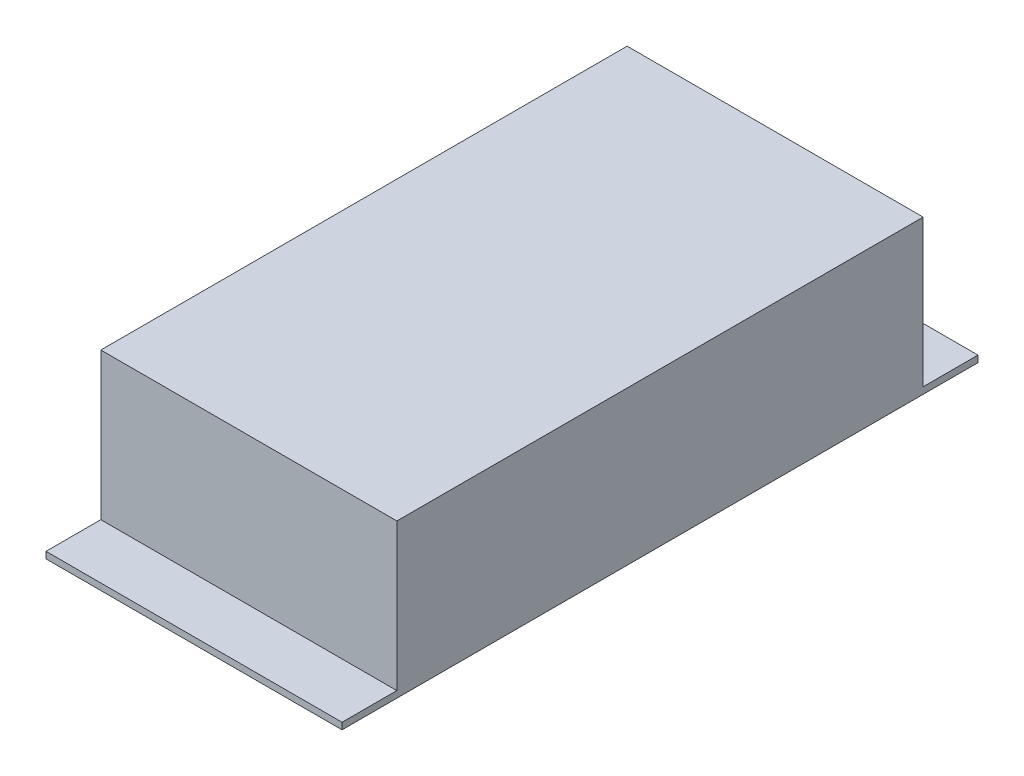
ISO-10303-21;
HEADER;
FILE_DESCRIPTION(('STEP AP214'),'2;1');
FILE_NAME('part.step','',(''),(''),'','','');
FILE_SCHEMA(('AUTOMOTIVE_DESIGN { 1 0 10303 214 1 1 1 1 }'));
ENDSEC;
DATA;
#1=APPLICATION_CONTEXT('core data for automotive mechanical design processes');
#2=APPLICATION_PROTOCOL_DEFINITION('international standard','automotive_design',2000,#1);
#3=PRODUCT_CONTEXT('',#1,'mechanical');
#4=PRODUCT('Part','Part','',(#3));
#5=PRODUCT_RELATED_PRODUCT_CATEGORY('part','',(#4));
#6=PRODUCT_DEFINITION_FORMATION('','',#4);
#7=PRODUCT_DEFINITION_CONTEXT('part definition',#1,'design');
#8=PRODUCT_DEFINITION('design','',#6,#7);
#9=PRODUCT_DEFINITION_SHAPE('','',#8);
#10=(LENGTH_UNIT() NAMED_UNIT(*) SI_UNIT(.MILLI.,.METRE.));
#11=(NAMED_UNIT(*) PLANE_ANGLE_UNIT() SI_UNIT($,.RADIAN.));
#12=(NAMED_UNIT(*) SI_UNIT($,.STERADIAN.) SOLID_ANGLE_UNIT());
#13=UNCERTAINTY_MEASURE_WITH_UNIT(LENGTH_MEASURE(1.E-05),#10,'distance_accuracy_value','');
#14=(GEOMETRIC_REPRESENTATION_CONTEXT(3) GLOBAL_UNCERTAINTY_ASSIGNED_CONTEXT((#13)) GLOBAL_UNIT_ASSIGNED_CONTEXT((#10,
#11,#12)) REPRESENTATION_CONTEXT('',''));
#15=CARTESIAN_POINT('',(0.,0.,0.));
#16=DIRECTION('',(0.,0.,1.));
#17=DIRECTION('',(1.,0.,0.));
#18=AXIS2_PLACEMENT_3D('',#15,#16,#17);
#19=CARTESIAN_POINT('',(67.5,70.,-145.));
#20=DIRECTION('',(-1.,0.,0.));
#21=DIRECTION('',(0.,0.,1.));
#22=AXIS2_PLACEMENT_3D('',#19,#20,#21);
#23=PLANE('',#22);
#24=DIRECTION('',(0.,0.,-1.));
#25=VECTOR('',#24,1.);
#26=CARTESIAN_POINT('',(67.5,3.,-145.));
#27=LINE('',#26,#25);
#28=CARTESIAN_POINT('',(67.5,3.,-120.));
#29=VERTEX_POINT('',#28);
#30=CARTESIAN_POINT('',(67.5,3.,-145.));
#31=VERTEX_POINT('',#30);
#32=EDGE_CURVE('E101',#29,#31,#27,.T.);
#33=ORIENTED_EDGE('',*,*,#32,.F.);
#34=DIRECTION('',(0.,1.,0.));
#35=VECTOR('',#34,1.);
#36=CARTESIAN_POINT('',(67.5,3.,-120.));
#37=LINE('',#36,#35);
#38=CARTESIAN_POINT('',(67.5,70.,-120.));
#39=VERTEX_POINT('',#38);
#40=EDGE_CURVE('E164',#29,#39,#37,.T.);
#41=ORIENTED_EDGE('',*,*,#40,.T.);
#42=DIRECTION('',(0.,0.,-1.));
#43=VECTOR('',#42,1.);
#44=CARTESIAN_POINT('',(67.5,70.,-145.));
#45=LINE('',#44,#43);
#46=CARTESIAN_POINT('',(67.5,70.,120.));
#47=VERTEX_POINT('',#46);
#48=EDGE_CURVE('E143',#47,#39,#45,.T.);
#49=ORIENTED_EDGE('',*,*,#48,.F.);
#50=DIRECTION('',(0.,1.,0.));
#51=VECTOR('',#50,1.);
#52=CARTESIAN_POINT('',(67.5,3.,120.));
#53=LINE('',#52,#51);
#54=CARTESIAN_POINT('',(67.5,3.,120.));
#55=VERTEX_POINT('',#54);
#56=EDGE_CURVE('E57',#55,#47,#53,.T.);
#57=ORIENTED_EDGE('',*,*,#56,.F.);
#58=DIRECTION('',(0.,0.,-1.));
#59=VECTOR('',#58,1.);
#60=CARTESIAN_POINT('',(67.5,3.,145.));
#61=LINE('',#60,#59);
#62=CARTESIAN_POINT('',(67.5,3.,145.));
#63=VERTEX_POINT('',#62);
#64=EDGE_CURVE('E162',#63,#55,#61,.T.);
#65=ORIENTED_EDGE('',*,*,#64,.F.);
#66=DIRECTION('',(0.,-1.,0.));
#67=VECTOR('',#66,1.);
#68=CARTESIAN_POINT('',(67.5,70.,145.));
#69=LINE('',#68,#67);
#70=CARTESIAN_POINT('',(67.5,0.,145.));
#71=VERTEX_POINT('',#70);
#72=EDGE_CURVE('E124',#63,#71,#69,.T.);
#73=ORIENTED_EDGE('',*,*,#72,.T.);
#74=DIRECTION('',(0.,0.,-1.));
#75=VECTOR('',#74,1.);
#76=CARTESIAN_POINT('',(67.5,0.,-145.));
#77=LINE('',#76,#75);
#78=CARTESIAN_POINT('',(67.5,0.,-145.));
#79=VERTEX_POINT('',#78);
#80=EDGE_CURVE('E121',#71,#79,#77,.T.);
#81=ORIENTED_EDGE('',*,*,#80,.T.);
#82=DIRECTION('',(0.,-1.,0.));
#83=VECTOR('',#82,1.);
#84=CARTESIAN_POINT('',(67.5,70.,-145.));
#85=LINE('',#84,#83);
#86=EDGE_CURVE('E11',#31,#79,#85,.T.);
#87=ORIENTED_EDGE('',*,*,#86,.F.);
#88=EDGE_LOOP('',(#33,#41,#49,#57,#65,#73,#81,#87));
#89=FACE_BOUND('',#88,.T.);
#90=ADVANCED_FACE('F35',(#89),#23,.F.);
#91=CARTESIAN_POINT('',(-67.5,70.,-145.));
#92=DIRECTION('',(0.,0.,1.));
#93=DIRECTION('',(1.,0.,0.));
#94=AXIS2_PLACEMENT_3D('',#91,#92,#93);
#95=PLANE('',#94);
#96=DIRECTION('',(0.,-1.,0.));
#97=VECTOR('',#96,1.);
#98=CARTESIAN_POINT('',(-67.5,70.,-145.));
#99=LINE('',#98,#97);
#100=CARTESIAN_POINT('',(-67.5,3.,-145.));
#101=VERTEX_POINT('',#100);
#102=CARTESIAN_POINT('',(-67.5,0.,-145.));
#103=VERTEX_POINT('',#102);
#104=EDGE_CURVE('E42',#101,#103,#99,.T.);
#105=ORIENTED_EDGE('',*,*,#104,.F.);
#106=DIRECTION('',(-1.,0.,0.));
#107=VECTOR('',#106,1.);
#108=CARTESIAN_POINT('',(67.5,3.,-145.));
#109=LINE('',#108,#107);
#110=EDGE_CURVE('E104',#31,#101,#109,.T.);
#111=ORIENTED_EDGE('',*,*,#110,.F.);
#112=ORIENTED_EDGE('',*,*,#86,.T.);
#113=DIRECTION('',(-1.,0.,0.));
#114=VECTOR('',#113,1.);
#115=CARTESIAN_POINT('',(-67.5,0.,-145.));
#116=LINE('',#115,#114);
#117=EDGE_CURVE('E128',#79,#103,#116,.T.);
#118=ORIENTED_EDGE('',*,*,#117,.T.);
#119=EDGE_LOOP('',(#105,#111,#112,#118));
#120=FACE_BOUND('',#119,.T.);
#121=ADVANCED_FACE('F114',(#120),#95,.F.);
#122=CARTESIAN_POINT('',(-67.5,70.,-145.));
#123=DIRECTION('',(1.,0.,0.));
#124=DIRECTION('',(0.,0.,-1.));
#125=AXIS2_PLACEMENT_3D('',#122,#123,#124);
#126=PLANE('',#125);
#127=DIRECTION('',(0.,0.,1.));
#128=VECTOR('',#127,1.);
#129=CARTESIAN_POINT('',(-67.5,70.,-145.));
#130=LINE('',#129,#128);
#131=CARTESIAN_POINT('',(-67.5,70.,-120.));
#132=VERTEX_POINT('',#131);
#133=CARTESIAN_POINT('',(-67.5,70.,120.));
#134=VERTEX_POINT('',#133);
#135=EDGE_CURVE('E136',#132,#134,#130,.T.);
#136=ORIENTED_EDGE('',*,*,#135,.F.);
#137=DIRECTION('',(0.,1.,0.));
#138=VECTOR('',#137,1.);
#139=CARTESIAN_POINT('',(-67.5,3.,-120.));
#140=LINE('',#139,#138);
#141=CARTESIAN_POINT('',(-67.5,3.,-120.));
#142=VERTEX_POINT('',#141);
#143=EDGE_CURVE('E49',#142,#132,#140,.T.);
#144=ORIENTED_EDGE('',*,*,#143,.F.);
#145=DIRECTION('',(0.,0.,1.));
#146=VECTOR('',#145,1.);
#147=CARTESIAN_POINT('',(-67.5,3.,-145.));
#148=LINE('',#147,#146);
#149=EDGE_CURVE('E117',#101,#142,#148,.T.);
#150=ORIENTED_EDGE('',*,*,#149,.F.);
#151=ORIENTED_EDGE('',*,*,#104,.T.);
#152=DIRECTION('',(0.,0.,1.));
#153=VECTOR('',#152,1.);
#154=CARTESIAN_POINT('',(-67.5,0.,-145.));
#155=LINE('',#154,#153);
#156=CARTESIAN_POINT('',(-67.5,0.,145.));
#157=VERTEX_POINT('',#156);
#158=EDGE_CURVE('E131',#103,#157,#155,.T.);
#159=ORIENTED_EDGE('',*,*,#158,.T.);
#160=DIRECTION('',(0.,-1.,0.));
#161=VECTOR('',#160,1.);
#162=CARTESIAN_POINT('',(-67.5,70.,145.));
#163=LINE('',#162,#161);
#164=CARTESIAN_POINT('',(-67.5,3.,145.));
#165=VERTEX_POINT('',#164);
#166=EDGE_CURVE('E145',#165,#157,#163,.T.);
#167=ORIENTED_EDGE('',*,*,#166,.F.);
#168=DIRECTION('',(0.,0.,1.));
#169=VECTOR('',#168,1.);
#170=CARTESIAN_POINT('',(-67.5,3.,145.));
#171=LINE('',#170,#169);
#172=CARTESIAN_POINT('',(-67.5,3.,120.));
#173=VERTEX_POINT('',#172);
#174=EDGE_CURVE('E157',#173,#165,#171,.T.);
#175=ORIENTED_EDGE('',*,*,#174,.F.);
#176=DIRECTION('',(0.,1.,0.));
#177=VECTOR('',#176,1.);
#178=CARTESIAN_POINT('',(-67.5,3.,120.));
#179=LINE('',#178,#177);
#180=EDGE_CURVE('E129',#173,#134,#179,.T.);
#181=ORIENTED_EDGE('',*,*,#180,.T.);
#182=EDGE_LOOP('',(#136,#144,#150,#151,#159,#167,#175,#181));
#183=FACE_BOUND('',#182,.T.);
#184=ADVANCED_FACE('F148',(#183),#126,.F.);
#185=CARTESIAN_POINT('',(-67.5,70.,145.));
#186=DIRECTION('',(0.,0.,-1.));
#187=DIRECTION('',(-1.,0.,0.));
#188=AXIS2_PLACEMENT_3D('',#185,#186,#187);
#189=PLANE('',#188);
#190=ORIENTED_EDGE('',*,*,#72,.F.);
#191=DIRECTION('',(1.,0.,0.));
#192=VECTOR('',#191,1.);
#193=CARTESIAN_POINT('',(-67.5,3.,145.));
#194=LINE('',#193,#192);
#195=EDGE_CURVE('E155',#165,#63,#194,.T.);
#196=ORIENTED_EDGE('',*,*,#195,.F.);
#197=ORIENTED_EDGE('',*,*,#166,.T.);
#198=DIRECTION('',(1.,0.,0.));
#199=VECTOR('',#198,1.);
#200=CARTESIAN_POINT('',(-67.5,0.,145.));
#201=LINE('',#200,#199);
#202=EDGE_CURVE('E141',#157,#71,#201,.T.);
#203=ORIENTED_EDGE('',*,*,#202,.T.);
#204=EDGE_LOOP('',(#190,#196,#197,#203));
#205=FACE_BOUND('',#204,.T.);
#206=ADVANCED_FACE('F153',(#205),#189,.F.);
#207=CARTESIAN_POINT('',(0.,70.,0.));
#208=DIRECTION('',(0.,1.,0.));
#209=DIRECTION('',(0.,0.,1.));
#210=AXIS2_PLACEMENT_3D('',#207,#208,#209);
#211=PLANE('',#210);
#212=DIRECTION('',(1.,0.,0.));
#213=VECTOR('',#212,1.);
#214=CARTESIAN_POINT('',(67.5,70.,-120.));
#215=LINE('',#214,#213);
#216=EDGE_CURVE('E110',#132,#39,#215,.T.);
#217=ORIENTED_EDGE('',*,*,#216,.F.);
#218=ORIENTED_EDGE('',*,*,#135,.T.);
#219=DIRECTION('',(-1.,0.,0.));
#220=VECTOR('',#219,1.);
#221=CARTESIAN_POINT('',(-67.5,70.,120.));
#222=LINE('',#221,#220);
#223=EDGE_CURVE('E160',#47,#134,#222,.T.);
#224=ORIENTED_EDGE('',*,*,#223,.F.);
#225=ORIENTED_EDGE('',*,*,#48,.T.);
#226=EDGE_LOOP('',(#217,#218,#224,#225));
#227=FACE_BOUND('',#226,.T.);
#228=ADVANCED_FACE('F175',(#227),#211,.T.);
#229=CARTESIAN_POINT('',(0.,0.,0.));
#230=DIRECTION('',(0.,1.,0.));
#231=DIRECTION('',(0.,0.,1.));
#232=AXIS2_PLACEMENT_3D('',#229,#230,#231);
#233=PLANE('',#232);
#234=ORIENTED_EDGE('',*,*,#80,.F.);
#235=ORIENTED_EDGE('',*,*,#202,.F.);
#236=ORIENTED_EDGE('',*,*,#158,.F.);
#237=ORIENTED_EDGE('',*,*,#117,.F.);
#238=EDGE_LOOP('',(#234,#235,#236,#237));
#239=FACE_BOUND('',#238,.T.);
#240=ADVANCED_FACE('F151',(#239),#233,.F.);
#241=CARTESIAN_POINT('',(-67.5,3.,120.));
#242=DIRECTION('',(0.,0.,-1.));
#243=DIRECTION('',(-1.,0.,0.));
#244=AXIS2_PLACEMENT_3D('',#241,#242,#243);
#245=PLANE('',#244);
#246=ORIENTED_EDGE('',*,*,#223,.T.);
#247=ORIENTED_EDGE('',*,*,#180,.F.);
#248=DIRECTION('',(-1.,0.,0.));
#249=VECTOR('',#248,1.);
#250=CARTESIAN_POINT('',(-67.5,3.,120.));
#251=LINE('',#250,#249);
#252=EDGE_CURVE('E170',#55,#173,#251,.T.);
#253=ORIENTED_EDGE('',*,*,#252,.F.);
#254=ORIENTED_EDGE('',*,*,#56,.T.);
#255=EDGE_LOOP('',(#246,#247,#253,#254));
#256=FACE_BOUND('',#255,.T.);
#257=ADVANCED_FACE('F176',(#256),#245,.F.);
#258=CARTESIAN_POINT('',(0.,3.,0.));
#259=DIRECTION('',(0.,-1.,0.));
#260=DIRECTION('',(0.,0.,-1.));
#261=AXIS2_PLACEMENT_3D('',#258,#259,#260);
#262=PLANE('',#261);
#263=ORIENTED_EDGE('',*,*,#174,.T.);
#264=ORIENTED_EDGE('',*,*,#195,.T.);
#265=ORIENTED_EDGE('',*,*,#64,.T.);
#266=ORIENTED_EDGE('',*,*,#252,.T.);
#267=EDGE_LOOP('',(#263,#264,#265,#266));
#268=FACE_BOUND('',#267,.T.);
#269=ADVANCED_FACE('F177',(#268),#262,.F.);
#270=CARTESIAN_POINT('',(67.5,3.,-120.));
#271=DIRECTION('',(0.,0.,1.));
#272=DIRECTION('',(1.,0.,0.));
#273=AXIS2_PLACEMENT_3D('',#270,#271,#272);
#274=PLANE('',#273);
#275=ORIENTED_EDGE('',*,*,#216,.T.);
#276=ORIENTED_EDGE('',*,*,#40,.F.);
#277=DIRECTION('',(1.,0.,0.));
#278=VECTOR('',#277,1.);
#279=CARTESIAN_POINT('',(67.5,3.,-120.));
#280=LINE('',#279,#278);
#281=EDGE_CURVE('E106',#142,#29,#280,.T.);
#282=ORIENTED_EDGE('',*,*,#281,.F.);
#283=ORIENTED_EDGE('',*,*,#143,.T.);
#284=EDGE_LOOP('',(#275,#276,#282,#283));
#285=FACE_BOUND('',#284,.T.);
#286=ADVANCED_FACE('F181',(#285),#274,.F.);
#287=CARTESIAN_POINT('',(0.,3.,0.));
#288=DIRECTION('',(0.,-1.,0.));
#289=DIRECTION('',(0.,0.,-1.));
#290=AXIS2_PLACEMENT_3D('',#287,#288,#289);
#291=PLANE('',#290);
#292=ORIENTED_EDGE('',*,*,#32,.T.);
#293=ORIENTED_EDGE('',*,*,#110,.T.);
#294=ORIENTED_EDGE('',*,*,#149,.T.);
#295=ORIENTED_EDGE('',*,*,#281,.T.);
#296=EDGE_LOOP('',(#292,#293,#294,#295));
#297=FACE_BOUND('',#296,.T.);
#298=ADVANCED_FACE('F103',(#297),#291,.F.);
#299=CLOSED_SHELL('',(#90,#121,#184,#206,#228,#240,#257,#269,#286,#298));
#300=MANIFOLD_SOLID_BREP('B2',#299);
#301=ADVANCED_BREP_SHAPE_REPRESENTATION('',(#18,#300),#14);
#302=SHAPE_DEFINITION_REPRESENTATION(#9,#301);
ENDSEC;
END-ISO-10303-21;
